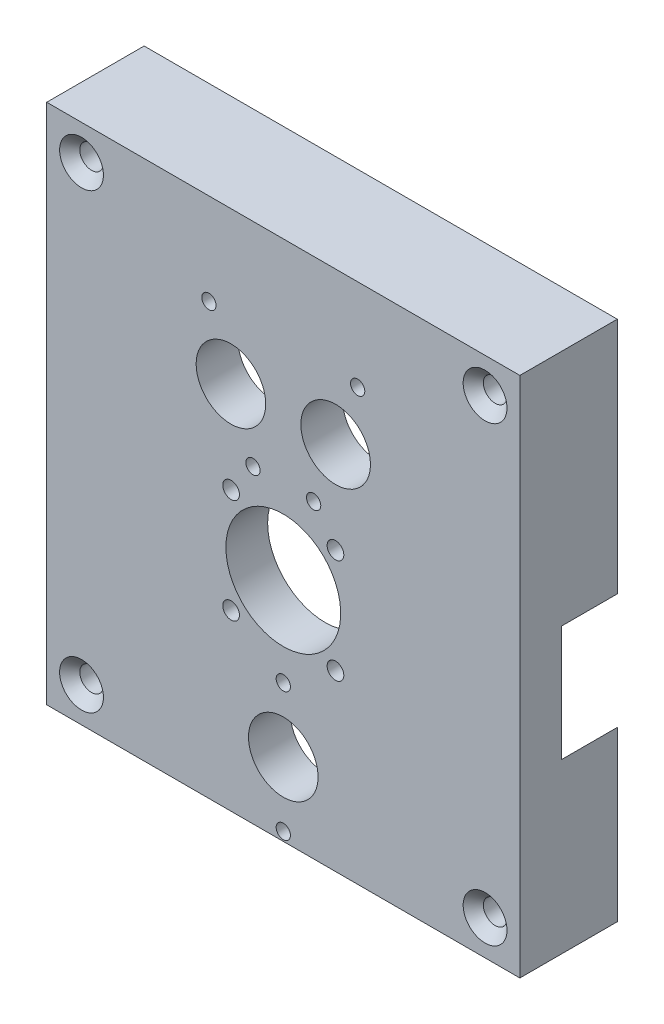
ISO-10303-21;
HEADER;
FILE_DESCRIPTION(('STEP AP214'),'2;1');
FILE_NAME('part.step','',(''),(''),'','','');
FILE_SCHEMA(('AUTOMOTIVE_DESIGN { 1 0 10303 214 1 1 1 1 }'));
ENDSEC;
DATA;
#1=APPLICATION_CONTEXT('core data for automotive mechanical design processes');
#2=APPLICATION_PROTOCOL_DEFINITION('international standard','automotive_design',2000,#1);
#3=PRODUCT_CONTEXT('',#1,'mechanical');
#4=PRODUCT('Part','Part','',(#3));
#5=PRODUCT_RELATED_PRODUCT_CATEGORY('part','',(#4));
#6=PRODUCT_DEFINITION_FORMATION('','',#4);
#7=PRODUCT_DEFINITION_CONTEXT('part definition',#1,'design');
#8=PRODUCT_DEFINITION('design','',#6,#7);
#9=PRODUCT_DEFINITION_SHAPE('','',#8);
#10=(LENGTH_UNIT() NAMED_UNIT(*) SI_UNIT(.MILLI.,.METRE.));
#11=(NAMED_UNIT(*) PLANE_ANGLE_UNIT() SI_UNIT($,.RADIAN.));
#12=(NAMED_UNIT(*) SI_UNIT($,.STERADIAN.) SOLID_ANGLE_UNIT());
#13=UNCERTAINTY_MEASURE_WITH_UNIT(LENGTH_MEASURE(1.E-05),#10,'distance_accuracy_value','');
#14=(GEOMETRIC_REPRESENTATION_CONTEXT(3) GLOBAL_UNCERTAINTY_ASSIGNED_CONTEXT((#13)) GLOBAL_UNIT_ASSIGNED_CONTEXT((#10,
#11,#12)) REPRESENTATION_CONTEXT('',''));
#15=CARTESIAN_POINT('',(0.,0.,0.));
#16=DIRECTION('',(0.,0.,1.));
#17=DIRECTION('',(1.,0.,0.));
#18=AXIS2_PLACEMENT_3D('',#15,#16,#17);
#19=CARTESIAN_POINT('',(0.,0.,0.));
#20=DIRECTION('',(0.,0.,-1.));
#21=DIRECTION('',(-1.,0.,0.));
#22=AXIS2_PLACEMENT_3D('',#19,#20,#21);
#23=PLANE('',#22);
#24=CARTESIAN_POINT('',(-29.,32.5,0.));
#25=DIRECTION('',(0.,0.,1.));
#26=DIRECTION('',(1.,0.,0.));
#27=AXIS2_PLACEMENT_3D('',#24,#25,#26);
#28=CIRCLE('',#27,1.7);
#29=CARTESIAN_POINT('',(-27.3,32.5,0.));
#30=VERTEX_POINT('',#29);
#31=EDGE_CURVE('E458',#30,#30,#28,.T.);
#32=ORIENTED_EDGE('',*,*,#31,.T.);
#33=EDGE_LOOP('',(#32));
#34=FACE_BOUND('',#33,.T.);
#35=CARTESIAN_POINT('',(29.,32.5,0.));
#36=DIRECTION('',(0.,0.,1.));
#37=DIRECTION('',(1.,0.,0.));
#38=AXIS2_PLACEMENT_3D('',#35,#36,#37);
#39=CIRCLE('',#38,1.7);
#40=CARTESIAN_POINT('',(30.7,32.5,0.));
#41=VERTEX_POINT('',#40);
#42=EDGE_CURVE('E484',#41,#41,#39,.T.);
#43=ORIENTED_EDGE('',*,*,#42,.T.);
#44=EDGE_LOOP('',(#43));
#45=FACE_BOUND('',#44,.T.);
#46=CARTESIAN_POINT('',(0.,-5.00000000000001,0.));
#47=DIRECTION('',(0.,0.,-1.));
#48=DIRECTION('',(-1.,0.,0.));
#49=AXIS2_PLACEMENT_3D('',#46,#47,#48);
#50=CIRCLE('',#49,35.);
#51=CARTESIAN_POINT('',(-34.,3.30662386291812,0.));
#52=VERTEX_POINT('',#51);
#53=CARTESIAN_POINT('',(34.,3.30662386291807,0.));
#54=VERTEX_POINT('',#53);
#55=EDGE_CURVE('E129',#52,#54,#50,.T.);
#56=ORIENTED_EDGE('',*,*,#55,.F.);
#57=DIRECTION('',(0.,-1.,0.));
#58=VECTOR('',#57,1.);
#59=CARTESIAN_POINT('',(-34.,-37.5,0.));
#60=LINE('',#59,#58);
#61=CARTESIAN_POINT('',(-34.,37.5,0.));
#62=VERTEX_POINT('',#61);
#63=EDGE_CURVE('E143',#62,#52,#60,.T.);
#64=ORIENTED_EDGE('',*,*,#63,.F.);
#65=DIRECTION('',(-1.,0.,0.));
#66=VECTOR('',#65,1.);
#67=CARTESIAN_POINT('',(-34.,37.5,0.));
#68=LINE('',#67,#66);
#69=CARTESIAN_POINT('',(34.,37.5,0.));
#70=VERTEX_POINT('',#69);
#71=EDGE_CURVE('E156',#70,#62,#68,.T.);
#72=ORIENTED_EDGE('',*,*,#71,.F.);
#73=DIRECTION('',(0.,1.,0.));
#74=VECTOR('',#73,1.);
#75=CARTESIAN_POINT('',(34.,-37.5,0.));
#76=LINE('',#75,#74);
#77=EDGE_CURVE('E144',#54,#70,#76,.T.);
#78=ORIENTED_EDGE('',*,*,#77,.F.);
#79=EDGE_LOOP('',(#56,#64,#72,#78));
#80=FACE_BOUND('',#79,.T.);
#81=ADVANCED_FACE('F37',(#34,#45,#80),#23,.T.);
#82=CARTESIAN_POINT('',(29.,-32.5,0.));
#83=DIRECTION('',(0.,0.,1.));
#84=DIRECTION('',(1.,0.,0.));
#85=AXIS2_PLACEMENT_3D('',#82,#83,#84);
#86=CIRCLE('',#85,1.7);
#87=CARTESIAN_POINT('',(30.7,-32.5,0.));
#88=VERTEX_POINT('',#87);
#89=EDGE_CURVE('E475',#88,#88,#86,.T.);
#90=ORIENTED_EDGE('',*,*,#89,.T.);
#91=EDGE_LOOP('',(#90));
#92=FACE_BOUND('',#91,.T.);
#93=CARTESIAN_POINT('',(34.,-13.3066238629181,0.));
#94=VERTEX_POINT('',#93);
#95=CARTESIAN_POINT('',(12.9903810567666,-37.5,0.));
#96=VERTEX_POINT('',#95);
#97=EDGE_CURVE('E146',#94,#96,#50,.T.);
#98=ORIENTED_EDGE('',*,*,#97,.F.);
#99=CARTESIAN_POINT('',(34.,-37.5,0.));
#100=VERTEX_POINT('',#99);
#101=EDGE_CURVE('E226',#100,#94,#76,.T.);
#102=ORIENTED_EDGE('',*,*,#101,.F.);
#103=DIRECTION('',(1.,0.,0.));
#104=VECTOR('',#103,1.);
#105=CARTESIAN_POINT('',(-34.,-37.5,0.));
#106=LINE('',#105,#104);
#107=EDGE_CURVE('E84',#96,#100,#106,.T.);
#108=ORIENTED_EDGE('',*,*,#107,.F.);
#109=EDGE_LOOP('',(#98,#102,#108));
#110=FACE_BOUND('',#109,.T.);
#111=ADVANCED_FACE('F243',(#92,#110),#23,.T.);
#112=CARTESIAN_POINT('',(0.,-5.00000000000001,14.));
#113=DIRECTION('',(0.,0.,-1.));
#114=DIRECTION('',(-1.,0.,0.));
#115=AXIS2_PLACEMENT_3D('',#112,#113,#114);
#116=CYLINDRICAL_SURFACE('',#115,8.25);
#117=CARTESIAN_POINT('',(0.,-5.00000000000001,14.));
#118=DIRECTION('',(0.,0.,-1.));
#119=DIRECTION('',(-1.,0.,0.));
#120=AXIS2_PLACEMENT_3D('',#117,#118,#119);
#121=CIRCLE('',#120,8.25);
#122=CARTESIAN_POINT('',(-8.25,-5.00000000000001,14.));
#123=VERTEX_POINT('',#122);
#124=EDGE_CURVE('E219',#123,#123,#121,.T.);
#125=ORIENTED_EDGE('',*,*,#124,.F.);
#126=EDGE_LOOP('',(#125));
#127=FACE_BOUND('',#126,.T.);
#128=CARTESIAN_POINT('',(0.,-5.00000000000001,8.));
#129=DIRECTION('',(0.,0.,-1.));
#130=DIRECTION('',(-1.,0.,0.));
#131=AXIS2_PLACEMENT_3D('',#128,#129,#130);
#132=CIRCLE('',#131,8.25);
#133=CARTESIAN_POINT('',(-8.25,-5.00000000000001,8.));
#134=VERTEX_POINT('',#133);
#135=EDGE_CURVE('E168',#134,#134,#132,.F.);
#136=ORIENTED_EDGE('',*,*,#135,.F.);
#137=EDGE_LOOP('',(#136));
#138=FACE_BOUND('',#137,.T.);
#139=ADVANCED_FACE('F241',(#127,#138),#116,.F.);
#140=CARTESIAN_POINT('',(34.,-37.5,14.));
#141=DIRECTION('',(-1.,0.,0.));
#142=DIRECTION('',(0.,0.,1.));
#143=AXIS2_PLACEMENT_3D('',#140,#141,#142);
#144=PLANE('',#143);
#145=DIRECTION('',(0.,-1.,0.));
#146=VECTOR('',#145,1.);
#147=CARTESIAN_POINT('',(34.,-37.5,8.));
#148=LINE('',#147,#146);
#149=CARTESIAN_POINT('',(34.,3.30662386291807,8.));
#150=VERTEX_POINT('',#149);
#151=CARTESIAN_POINT('',(34.,-13.3066238629181,8.));
#152=VERTEX_POINT('',#151);
#153=EDGE_CURVE('E208',#150,#152,#148,.T.);
#154=ORIENTED_EDGE('',*,*,#153,.F.);
#155=DIRECTION('',(0.,0.,-1.));
#156=VECTOR('',#155,1.);
#157=CARTESIAN_POINT('',(34.,3.30662386291807,8.));
#158=LINE('',#157,#156);
#159=EDGE_CURVE('E217',#150,#54,#158,.T.);
#160=ORIENTED_EDGE('',*,*,#159,.T.);
#161=ORIENTED_EDGE('',*,*,#77,.T.);
#162=DIRECTION('',(0.,0.,-1.));
#163=VECTOR('',#162,1.);
#164=CARTESIAN_POINT('',(34.,37.5,14.));
#165=LINE('',#164,#163);
#166=CARTESIAN_POINT('',(34.,37.5,14.));
#167=VERTEX_POINT('',#166);
#168=EDGE_CURVE('E11',#167,#70,#165,.T.);
#169=ORIENTED_EDGE('',*,*,#168,.F.);
#170=DIRECTION('',(0.,1.,0.));
#171=VECTOR('',#170,1.);
#172=CARTESIAN_POINT('',(34.,-37.5,14.));
#173=LINE('',#172,#171);
#174=CARTESIAN_POINT('',(34.,-37.5,14.));
#175=VERTEX_POINT('',#174);
#176=EDGE_CURVE('E161',#175,#167,#173,.T.);
#177=ORIENTED_EDGE('',*,*,#176,.F.);
#178=DIRECTION('',(0.,0.,-1.));
#179=VECTOR('',#178,1.);
#180=CARTESIAN_POINT('',(34.,-37.5,14.));
#181=LINE('',#180,#179);
#182=EDGE_CURVE('E162',#175,#100,#181,.T.);
#183=ORIENTED_EDGE('',*,*,#182,.T.);
#184=ORIENTED_EDGE('',*,*,#101,.T.);
#185=DIRECTION('',(0.,0.,-1.));
#186=VECTOR('',#185,1.);
#187=CARTESIAN_POINT('',(34.,-13.3066238629181,8.));
#188=LINE('',#187,#186);
#189=EDGE_CURVE('E214',#94,#152,#188,.F.);
#190=ORIENTED_EDGE('',*,*,#189,.T.);
#191=EDGE_LOOP('',(#154,#160,#161,#169,#177,#183,#184,#190));
#192=FACE_BOUND('',#191,.T.);
#193=ADVANCED_FACE('F39',(#192),#144,.F.);
#194=CARTESIAN_POINT('',(-34.,37.5,14.));
#195=DIRECTION('',(0.,-1.,0.));
#196=DIRECTION('',(0.,0.,-1.));
#197=AXIS2_PLACEMENT_3D('',#194,#195,#196);
#198=PLANE('',#197);
#199=ORIENTED_EDGE('',*,*,#71,.T.);
#200=DIRECTION('',(0.,0.,-1.));
#201=VECTOR('',#200,1.);
#202=CARTESIAN_POINT('',(-34.,37.5,14.));
#203=LINE('',#202,#201);
#204=CARTESIAN_POINT('',(-34.,37.5,14.));
#205=VERTEX_POINT('',#204);
#206=EDGE_CURVE('E46',#205,#62,#203,.T.);
#207=ORIENTED_EDGE('',*,*,#206,.F.);
#208=DIRECTION('',(-1.,0.,0.));
#209=VECTOR('',#208,1.);
#210=CARTESIAN_POINT('',(-34.,37.5,14.));
#211=LINE('',#210,#209);
#212=EDGE_CURVE('E91',#167,#205,#211,.T.);
#213=ORIENTED_EDGE('',*,*,#212,.F.);
#214=ORIENTED_EDGE('',*,*,#168,.T.);
#215=EDGE_LOOP('',(#199,#207,#213,#214));
#216=FACE_BOUND('',#215,.T.);
#217=ADVANCED_FACE('F233',(#216),#198,.F.);
#218=CARTESIAN_POINT('',(-34.,-37.5,14.));
#219=DIRECTION('',(1.,0.,0.));
#220=DIRECTION('',(0.,0.,-1.));
#221=AXIS2_PLACEMENT_3D('',#218,#219,#220);
#222=PLANE('',#221);
#223=DIRECTION('',(0.,1.,0.));
#224=VECTOR('',#223,1.);
#225=CARTESIAN_POINT('',(-34.,-37.5,8.));
#226=LINE('',#225,#224);
#227=CARTESIAN_POINT('',(-34.,-13.3066238629181,8.));
#228=VERTEX_POINT('',#227);
#229=CARTESIAN_POINT('',(-34.,3.30662386291812,8.));
#230=VERTEX_POINT('',#229);
#231=EDGE_CURVE('E206',#228,#230,#226,.T.);
#232=ORIENTED_EDGE('',*,*,#231,.F.);
#233=DIRECTION('',(0.,0.,-1.));
#234=VECTOR('',#233,1.);
#235=CARTESIAN_POINT('',(-34.,-13.3066238629181,8.));
#236=LINE('',#235,#234);
#237=CARTESIAN_POINT('',(-34.,-13.3066238629181,0.));
#238=VERTEX_POINT('',#237);
#239=EDGE_CURVE('E136',#228,#238,#236,.T.);
#240=ORIENTED_EDGE('',*,*,#239,.T.);
#241=CARTESIAN_POINT('',(-34.,-37.5,0.));
#242=VERTEX_POINT('',#241);
#243=EDGE_CURVE('E152',#238,#242,#60,.T.);
#244=ORIENTED_EDGE('',*,*,#243,.T.);
#245=DIRECTION('',(0.,0.,-1.));
#246=VECTOR('',#245,1.);
#247=CARTESIAN_POINT('',(-34.,-37.5,14.));
#248=LINE('',#247,#246);
#249=CARTESIAN_POINT('',(-34.,-37.5,14.));
#250=VERTEX_POINT('',#249);
#251=EDGE_CURVE('E164',#250,#242,#248,.T.);
#252=ORIENTED_EDGE('',*,*,#251,.F.);
#253=DIRECTION('',(0.,-1.,0.));
#254=VECTOR('',#253,1.);
#255=CARTESIAN_POINT('',(-34.,-37.5,14.));
#256=LINE('',#255,#254);
#257=EDGE_CURVE('E224',#205,#250,#256,.T.);
#258=ORIENTED_EDGE('',*,*,#257,.F.);
#259=ORIENTED_EDGE('',*,*,#206,.T.);
#260=ORIENTED_EDGE('',*,*,#63,.T.);
#261=DIRECTION('',(0.,0.,-1.));
#262=VECTOR('',#261,1.);
#263=CARTESIAN_POINT('',(-34.,3.30662386291812,8.));
#264=LINE('',#263,#262);
#265=EDGE_CURVE('E126',#52,#230,#264,.F.);
#266=ORIENTED_EDGE('',*,*,#265,.T.);
#267=EDGE_LOOP('',(#232,#240,#244,#252,#258,#259,#260,#266));
#268=FACE_BOUND('',#267,.T.);
#269=ADVANCED_FACE('F150',(#268),#222,.F.);
#270=CARTESIAN_POINT('',(-34.,-37.5,14.));
#271=DIRECTION('',(0.,1.,0.));
#272=DIRECTION('',(0.,0.,1.));
#273=AXIS2_PLACEMENT_3D('',#270,#271,#272);
#274=PLANE('',#273);
#275=DIRECTION('',(-1.,0.,0.));
#276=VECTOR('',#275,1.);
#277=CARTESIAN_POINT('',(-34.,-37.5,8.));
#278=LINE('',#277,#276);
#279=CARTESIAN_POINT('',(12.9903810567666,-37.5,8.));
#280=VERTEX_POINT('',#279);
#281=CARTESIAN_POINT('',(-12.9903810567666,-37.5,8.));
#282=VERTEX_POINT('',#281);
#283=EDGE_CURVE('E171',#280,#282,#278,.T.);
#284=ORIENTED_EDGE('',*,*,#283,.F.);
#285=DIRECTION('',(0.,0.,-1.));
#286=VECTOR('',#285,1.);
#287=CARTESIAN_POINT('',(12.9903810567666,-37.5,8.));
#288=LINE('',#287,#286);
#289=EDGE_CURVE('E137',#280,#96,#288,.T.);
#290=ORIENTED_EDGE('',*,*,#289,.T.);
#291=ORIENTED_EDGE('',*,*,#107,.T.);
#292=ORIENTED_EDGE('',*,*,#182,.F.);
#293=DIRECTION('',(1.,0.,0.));
#294=VECTOR('',#293,1.);
#295=CARTESIAN_POINT('',(-34.,-37.5,14.));
#296=LINE('',#295,#294);
#297=EDGE_CURVE('E63',#250,#175,#296,.T.);
#298=ORIENTED_EDGE('',*,*,#297,.F.);
#299=ORIENTED_EDGE('',*,*,#251,.T.);
#300=CARTESIAN_POINT('',(-12.9903810567666,-37.5,0.));
#301=VERTEX_POINT('',#300);
#302=EDGE_CURVE('E154',#242,#301,#106,.T.);
#303=ORIENTED_EDGE('',*,*,#302,.T.);
#304=DIRECTION('',(0.,0.,-1.));
#305=VECTOR('',#304,1.);
#306=CARTESIAN_POINT('',(-12.9903810567666,-37.5,8.));
#307=LINE('',#306,#305);
#308=EDGE_CURVE('E54',#301,#282,#307,.F.);
#309=ORIENTED_EDGE('',*,*,#308,.T.);
#310=EDGE_LOOP('',(#284,#290,#291,#292,#298,#299,#303,#309));
#311=FACE_BOUND('',#310,.T.);
#312=ADVANCED_FACE('F239',(#311),#274,.F.);
#313=CARTESIAN_POINT('',(0.,0.,14.));
#314=DIRECTION('',(0.,0.,-1.));
#315=DIRECTION('',(-1.,0.,0.));
#316=AXIS2_PLACEMENT_3D('',#313,#314,#315);
#317=PLANE('',#316);
#318=CARTESIAN_POINT('',(-29.,32.5,14.));
#319=DIRECTION('',(0.,0.,1.));
#320=DIRECTION('',(1.,0.,0.));
#321=AXIS2_PLACEMENT_3D('',#318,#319,#320);
#322=CIRCLE('',#321,3.15);
#323=CARTESIAN_POINT('',(-25.85,32.5,14.));
#324=VERTEX_POINT('',#323);
#325=EDGE_CURVE('E456',#324,#324,#322,.T.);
#326=ORIENTED_EDGE('',*,*,#325,.F.);
#327=EDGE_LOOP('',(#326));
#328=FACE_BOUND('',#327,.T.);
#329=CARTESIAN_POINT('',(-29.,-32.5,14.));
#330=DIRECTION('',(0.,0.,1.));
#331=DIRECTION('',(1.,0.,0.));
#332=AXIS2_PLACEMENT_3D('',#329,#330,#331);
#333=CIRCLE('',#332,3.15);
#334=CARTESIAN_POINT('',(-25.85,-32.5,14.));
#335=VERTEX_POINT('',#334);
#336=EDGE_CURVE('E462',#335,#335,#333,.T.);
#337=ORIENTED_EDGE('',*,*,#336,.F.);
#338=EDGE_LOOP('',(#337));
#339=FACE_BOUND('',#338,.T.);
#340=CARTESIAN_POINT('',(29.,-32.5,14.));
#341=DIRECTION('',(0.,0.,1.));
#342=DIRECTION('',(1.,0.,0.));
#343=AXIS2_PLACEMENT_3D('',#340,#341,#342);
#344=CIRCLE('',#343,3.15);
#345=CARTESIAN_POINT('',(32.15,-32.5,14.));
#346=VERTEX_POINT('',#345);
#347=EDGE_CURVE('E469',#346,#346,#344,.T.);
#348=ORIENTED_EDGE('',*,*,#347,.F.);
#349=EDGE_LOOP('',(#348));
#350=FACE_BOUND('',#349,.T.);
#351=CARTESIAN_POINT('',(29.,32.5,14.));
#352=DIRECTION('',(0.,0.,1.));
#353=DIRECTION('',(1.,0.,0.));
#354=AXIS2_PLACEMENT_3D('',#351,#352,#353);
#355=CIRCLE('',#354,3.15);
#356=CARTESIAN_POINT('',(32.15,32.5,14.));
#357=VERTEX_POINT('',#356);
#358=EDGE_CURVE('E478',#357,#357,#355,.T.);
#359=ORIENTED_EDGE('',*,*,#358,.F.);
#360=EDGE_LOOP('',(#359));
#361=FACE_BOUND('',#360,.T.);
#362=CARTESIAN_POINT('',(-7.52444315316458,15.67323765729,14.));
#363=DIRECTION('',(0.,0.,-1.));
#364=DIRECTION('',(-1.,0.,0.));
#365=AXIS2_PLACEMENT_3D('',#362,#363,#364);
#366=CIRCLE('',#365,5.);
#367=CARTESIAN_POINT('',(-12.5244431531646,15.67323765729,14.));
#368=VERTEX_POINT('',#367);
#369=EDGE_CURVE('E487',#368,#368,#366,.T.);
#370=ORIENTED_EDGE('',*,*,#369,.T.);
#371=EDGE_LOOP('',(#370));
#372=FACE_BOUND('',#371,.T.);
#373=CARTESIAN_POINT('',(0.,-27.,14.));
#374=DIRECTION('',(0.,0.,-1.));
#375=DIRECTION('',(-1.,0.,0.));
#376=AXIS2_PLACEMENT_3D('',#373,#374,#375);
#377=CIRCLE('',#376,5.);
#378=CARTESIAN_POINT('',(-5.,-27.,14.));
#379=VERTEX_POINT('',#378);
#380=EDGE_CURVE('E491',#379,#379,#377,.T.);
#381=ORIENTED_EDGE('',*,*,#380,.T.);
#382=EDGE_LOOP('',(#381));
#383=FACE_BOUND('',#382,.T.);
#384=CARTESIAN_POINT('',(7.52444315316458,15.67323765729,14.));
#385=DIRECTION('',(0.,0.,-1.));
#386=DIRECTION('',(-1.,0.,0.));
#387=AXIS2_PLACEMENT_3D('',#384,#385,#386);
#388=CIRCLE('',#387,5.);
#389=CARTESIAN_POINT('',(2.52444315316458,15.67323765729,14.));
#390=VERTEX_POINT('',#389);
#391=EDGE_CURVE('E495',#390,#390,#388,.T.);
#392=ORIENTED_EDGE('',*,*,#391,.T.);
#393=EDGE_LOOP('',(#392));
#394=FACE_BOUND('',#393,.T.);
#395=CARTESIAN_POINT('',(0.,-17.75,14.));
#396=DIRECTION('',(0.,0.,-1.));
#397=DIRECTION('',(-1.,0.,0.));
#398=AXIS2_PLACEMENT_3D('',#395,#396,#397);
#399=CIRCLE('',#398,1.02499999999999);
#400=CARTESIAN_POINT('',(-1.02499999999999,-17.75,14.));
#401=VERTEX_POINT('',#400);
#402=EDGE_CURVE('E500',#401,#401,#399,.T.);
#403=ORIENTED_EDGE('',*,*,#402,.T.);
#404=EDGE_LOOP('',(#403));
#405=FACE_BOUND('',#404,.T.);
#406=CARTESIAN_POINT('',(0.,-36.25,14.));
#407=DIRECTION('',(0.,0.,-1.));
#408=DIRECTION('',(-1.,0.,0.));
#409=AXIS2_PLACEMENT_3D('',#406,#407,#408);
#410=CIRCLE('',#409,1.02499999999999);
#411=CARTESIAN_POINT('',(-1.02499999999999,-36.25,14.));
#412=VERTEX_POINT('',#411);
#413=EDGE_CURVE('E504',#412,#412,#410,.T.);
#414=ORIENTED_EDGE('',*,*,#413,.T.);
#415=EDGE_LOOP('',(#414));
#416=FACE_BOUND('',#415,.T.);
#417=CARTESIAN_POINT('',(10.688129478927,24.3653943995597,14.));
#418=DIRECTION('',(0.,0.,-1.));
#419=DIRECTION('',(-1.,0.,0.));
#420=AXIS2_PLACEMENT_3D('',#417,#418,#419);
#421=CIRCLE('',#420,1.025);
#422=CARTESIAN_POINT('',(9.66312947892696,24.3653943995597,14.));
#423=VERTEX_POINT('',#422);
#424=EDGE_CURVE('E508',#423,#423,#421,.T.);
#425=ORIENTED_EDGE('',*,*,#424,.T.);
#426=EDGE_LOOP('',(#425));
#427=FACE_BOUND('',#426,.T.);
#428=CARTESIAN_POINT('',(4.3607568274022,6.98108091502035,14.));
#429=DIRECTION('',(0.,0.,-1.));
#430=DIRECTION('',(-1.,0.,0.));
#431=AXIS2_PLACEMENT_3D('',#428,#429,#430);
#432=CIRCLE('',#431,1.025);
#433=CARTESIAN_POINT('',(3.3357568274022,6.98108091502035,14.));
#434=VERTEX_POINT('',#433);
#435=EDGE_CURVE('E512',#434,#434,#432,.T.);
#436=ORIENTED_EDGE('',*,*,#435,.T.);
#437=EDGE_LOOP('',(#436));
#438=FACE_BOUND('',#437,.T.);
#439=CARTESIAN_POINT('',(-10.688129478927,24.3653943995597,14.));
#440=DIRECTION('',(0.,0.,-1.));
#441=DIRECTION('',(-1.,0.,0.));
#442=AXIS2_PLACEMENT_3D('',#439,#440,#441);
#443=CIRCLE('',#442,1.025);
#444=CARTESIAN_POINT('',(-11.713129478927,24.3653943995597,14.));
#445=VERTEX_POINT('',#444);
#446=EDGE_CURVE('E516',#445,#445,#443,.T.);
#447=ORIENTED_EDGE('',*,*,#446,.T.);
#448=EDGE_LOOP('',(#447));
#449=FACE_BOUND('',#448,.T.);
#450=CARTESIAN_POINT('',(-4.3607568274022,6.98108091502035,14.));
#451=DIRECTION('',(0.,0.,-1.));
#452=DIRECTION('',(-1.,0.,0.));
#453=AXIS2_PLACEMENT_3D('',#450,#451,#452);
#454=CIRCLE('',#453,1.025);
#455=CARTESIAN_POINT('',(-5.3857568274022,6.98108091502035,14.));
#456=VERTEX_POINT('',#455);
#457=EDGE_CURVE('E520',#456,#456,#454,.T.);
#458=ORIENTED_EDGE('',*,*,#457,.T.);
#459=EDGE_LOOP('',(#458));
#460=FACE_BOUND('',#459,.T.);
#461=CARTESIAN_POINT('',(7.5,2.49999999999999,14.));
#462=DIRECTION('',(0.,0.,-1.));
#463=DIRECTION('',(-1.,0.,0.));
#464=AXIS2_PLACEMENT_3D('',#461,#462,#463);
#465=CIRCLE('',#464,1.19999999999999);
#466=CARTESIAN_POINT('',(6.30000000000001,2.49999999999999,14.));
#467=VERTEX_POINT('',#466);
#468=EDGE_CURVE('E41',#467,#467,#465,.T.);
#469=ORIENTED_EDGE('',*,*,#468,.T.);
#470=EDGE_LOOP('',(#469));
#471=FACE_BOUND('',#470,.T.);
#472=CARTESIAN_POINT('',(-7.5,-12.5,14.));
#473=DIRECTION('',(0.,0.,-1.));
#474=DIRECTION('',(-1.,0.,0.));
#475=AXIS2_PLACEMENT_3D('',#472,#473,#474);
#476=CIRCLE('',#475,1.19999999999999);
#477=CARTESIAN_POINT('',(-8.69999999999999,-12.5,14.));
#478=VERTEX_POINT('',#477);
#479=EDGE_CURVE('E180',#478,#478,#476,.T.);
#480=ORIENTED_EDGE('',*,*,#479,.T.);
#481=EDGE_LOOP('',(#480));
#482=FACE_BOUND('',#481,.T.);
#483=CARTESIAN_POINT('',(7.5,-12.5,14.));
#484=DIRECTION('',(0.,0.,-1.));
#485=DIRECTION('',(-1.,0.,0.));
#486=AXIS2_PLACEMENT_3D('',#483,#484,#485);
#487=CIRCLE('',#486,1.19999999999999);
#488=CARTESIAN_POINT('',(6.30000000000001,-12.5,14.));
#489=VERTEX_POINT('',#488);
#490=EDGE_CURVE('E176',#489,#489,#487,.T.);
#491=ORIENTED_EDGE('',*,*,#490,.T.);
#492=EDGE_LOOP('',(#491));
#493=FACE_BOUND('',#492,.T.);
#494=CARTESIAN_POINT('',(-7.5,2.49999999999999,14.));
#495=DIRECTION('',(0.,0.,-1.));
#496=DIRECTION('',(-1.,0.,0.));
#497=AXIS2_PLACEMENT_3D('',#494,#495,#496);
#498=CIRCLE('',#497,1.19999999999999);
#499=CARTESIAN_POINT('',(-8.69999999999999,2.49999999999999,14.));
#500=VERTEX_POINT('',#499);
#501=EDGE_CURVE('E172',#500,#500,#498,.T.);
#502=ORIENTED_EDGE('',*,*,#501,.T.);
#503=EDGE_LOOP('',(#502));
#504=FACE_BOUND('',#503,.T.);
#505=ORIENTED_EDGE('',*,*,#124,.T.);
#506=EDGE_LOOP('',(#505));
#507=FACE_BOUND('',#506,.T.);
#508=ORIENTED_EDGE('',*,*,#176,.T.);
#509=ORIENTED_EDGE('',*,*,#212,.T.);
#510=ORIENTED_EDGE('',*,*,#257,.T.);
#511=ORIENTED_EDGE('',*,*,#297,.T.);
#512=EDGE_LOOP('',(#508,#509,#510,#511));
#513=FACE_BOUND('',#512,.T.);
#514=ADVANCED_FACE('F256',(#328,#339,#350,#361,#372,#383,#394,#405,#416,#427,#438,#449,#460,
#471,#482,#493,#504,#507,#513),#317,.F.);
#515=CARTESIAN_POINT('',(-29.,-32.5,0.));
#516=DIRECTION('',(0.,0.,1.));
#517=DIRECTION('',(1.,0.,0.));
#518=AXIS2_PLACEMENT_3D('',#515,#516,#517);
#519=CIRCLE('',#518,1.7);
#520=CARTESIAN_POINT('',(-27.3,-32.5,0.));
#521=VERTEX_POINT('',#520);
#522=EDGE_CURVE('E269',#521,#521,#519,.T.);
#523=ORIENTED_EDGE('',*,*,#522,.T.);
#524=EDGE_LOOP('',(#523));
#525=FACE_BOUND('',#524,.T.);
#526=EDGE_CURVE('E148',#301,#238,#50,.T.);
#527=ORIENTED_EDGE('',*,*,#526,.F.);
#528=ORIENTED_EDGE('',*,*,#302,.F.);
#529=ORIENTED_EDGE('',*,*,#243,.F.);
#530=EDGE_LOOP('',(#527,#528,#529));
#531=FACE_BOUND('',#530,.T.);
#532=ADVANCED_FACE('F246',(#525,#531),#23,.T.);
#533=CARTESIAN_POINT('',(0.,-5.00000000000001,8.));
#534=DIRECTION('',(0.,0.,-1.));
#535=DIRECTION('',(-1.,0.,0.));
#536=AXIS2_PLACEMENT_3D('',#533,#534,#535);
#537=CYLINDRICAL_SURFACE('',#536,35.);
#538=CARTESIAN_POINT('',(0.,-5.00000000000001,8.));
#539=DIRECTION('',(0.,0.,-1.));
#540=DIRECTION('',(-1.,0.,0.));
#541=AXIS2_PLACEMENT_3D('',#538,#539,#540);
#542=CIRCLE('',#541,35.);
#543=EDGE_CURVE('E132',#230,#150,#542,.T.);
#544=ORIENTED_EDGE('',*,*,#543,.F.);
#545=ORIENTED_EDGE('',*,*,#265,.F.);
#546=ORIENTED_EDGE('',*,*,#55,.T.);
#547=ORIENTED_EDGE('',*,*,#159,.F.);
#548=EDGE_LOOP('',(#544,#545,#546,#547));
#549=FACE_BOUND('',#548,.T.);
#550=ADVANCED_FACE('F128',(#549),#537,.F.);
#551=ORIENTED_EDGE('',*,*,#97,.T.);
#552=ORIENTED_EDGE('',*,*,#289,.F.);
#553=EDGE_CURVE('E203',#152,#280,#542,.T.);
#554=ORIENTED_EDGE('',*,*,#553,.F.);
#555=ORIENTED_EDGE('',*,*,#189,.F.);
#556=EDGE_LOOP('',(#551,#552,#554,#555));
#557=FACE_BOUND('',#556,.T.);
#558=ADVANCED_FACE('F262',(#557),#537,.F.);
#559=EDGE_CURVE('E145',#282,#228,#542,.T.);
#560=ORIENTED_EDGE('',*,*,#559,.F.);
#561=ORIENTED_EDGE('',*,*,#308,.F.);
#562=ORIENTED_EDGE('',*,*,#526,.T.);
#563=ORIENTED_EDGE('',*,*,#239,.F.);
#564=EDGE_LOOP('',(#560,#561,#562,#563));
#565=FACE_BOUND('',#564,.T.);
#566=ADVANCED_FACE('F264',(#565),#537,.F.);
#567=CARTESIAN_POINT('',(0.,-5.00000000000001,8.));
#568=DIRECTION('',(0.,0.,-1.));
#569=DIRECTION('',(-1.,0.,0.));
#570=AXIS2_PLACEMENT_3D('',#567,#568,#569);
#571=PLANE('',#570);
#572=CARTESIAN_POINT('',(-7.52444315316458,15.67323765729,8.));
#573=DIRECTION('',(0.,0.,-1.));
#574=DIRECTION('',(-1.,0.,0.));
#575=AXIS2_PLACEMENT_3D('',#572,#573,#574);
#576=CIRCLE('',#575,5.);
#577=CARTESIAN_POINT('',(-12.5244431531646,15.67323765729,8.));
#578=VERTEX_POINT('',#577);
#579=EDGE_CURVE('E308',#578,#578,#576,.T.);
#580=ORIENTED_EDGE('',*,*,#579,.F.);
#581=EDGE_LOOP('',(#580));
#582=FACE_BOUND('',#581,.T.);
#583=CARTESIAN_POINT('',(0.,-27.,8.));
#584=DIRECTION('',(0.,0.,-1.));
#585=DIRECTION('',(-1.,0.,0.));
#586=AXIS2_PLACEMENT_3D('',#583,#584,#585);
#587=CIRCLE('',#586,5.);
#588=CARTESIAN_POINT('',(-5.,-27.,8.));
#589=VERTEX_POINT('',#588);
#590=EDGE_CURVE('E312',#589,#589,#587,.T.);
#591=ORIENTED_EDGE('',*,*,#590,.F.);
#592=EDGE_LOOP('',(#591));
#593=FACE_BOUND('',#592,.T.);
#594=CARTESIAN_POINT('',(7.52444315316458,15.67323765729,8.));
#595=DIRECTION('',(0.,0.,-1.));
#596=DIRECTION('',(-1.,0.,0.));
#597=AXIS2_PLACEMENT_3D('',#594,#595,#596);
#598=CIRCLE('',#597,5.);
#599=CARTESIAN_POINT('',(2.52444315316458,15.67323765729,8.));
#600=VERTEX_POINT('',#599);
#601=EDGE_CURVE('E316',#600,#600,#598,.T.);
#602=ORIENTED_EDGE('',*,*,#601,.F.);
#603=EDGE_LOOP('',(#602));
#604=FACE_BOUND('',#603,.T.);
#605=CARTESIAN_POINT('',(0.,-17.75,8.));
#606=DIRECTION('',(0.,0.,-1.));
#607=DIRECTION('',(-1.,0.,0.));
#608=AXIS2_PLACEMENT_3D('',#605,#606,#607);
#609=CIRCLE('',#608,1.02499999999999);
#610=CARTESIAN_POINT('',(-1.02499999999999,-17.75,8.));
#611=VERTEX_POINT('',#610);
#612=EDGE_CURVE('E320',#611,#611,#609,.T.);
#613=ORIENTED_EDGE('',*,*,#612,.F.);
#614=EDGE_LOOP('',(#613));
#615=FACE_BOUND('',#614,.T.);
#616=CARTESIAN_POINT('',(0.,-36.25,8.));
#617=DIRECTION('',(0.,0.,-1.));
#618=DIRECTION('',(-1.,0.,0.));
#619=AXIS2_PLACEMENT_3D('',#616,#617,#618);
#620=CIRCLE('',#619,1.02499999999999);
#621=CARTESIAN_POINT('',(-1.02499999999999,-36.25,8.));
#622=VERTEX_POINT('',#621);
#623=EDGE_CURVE('E324',#622,#622,#620,.T.);
#624=ORIENTED_EDGE('',*,*,#623,.F.);
#625=EDGE_LOOP('',(#624));
#626=FACE_BOUND('',#625,.T.);
#627=CARTESIAN_POINT('',(10.688129478927,24.3653943995597,8.));
#628=DIRECTION('',(0.,0.,-1.));
#629=DIRECTION('',(-1.,0.,0.));
#630=AXIS2_PLACEMENT_3D('',#627,#628,#629);
#631=CIRCLE('',#630,1.025);
#632=CARTESIAN_POINT('',(9.66312947892696,24.3653943995597,8.));
#633=VERTEX_POINT('',#632);
#634=EDGE_CURVE('E328',#633,#633,#631,.T.);
#635=ORIENTED_EDGE('',*,*,#634,.F.);
#636=EDGE_LOOP('',(#635));
#637=FACE_BOUND('',#636,.T.);
#638=CARTESIAN_POINT('',(4.3607568274022,6.98108091502035,8.));
#639=DIRECTION('',(0.,0.,-1.));
#640=DIRECTION('',(-1.,0.,0.));
#641=AXIS2_PLACEMENT_3D('',#638,#639,#640);
#642=CIRCLE('',#641,1.025);
#643=CARTESIAN_POINT('',(3.3357568274022,6.98108091502035,8.));
#644=VERTEX_POINT('',#643);
#645=EDGE_CURVE('E332',#644,#644,#642,.T.);
#646=ORIENTED_EDGE('',*,*,#645,.F.);
#647=EDGE_LOOP('',(#646));
#648=FACE_BOUND('',#647,.T.);
#649=CARTESIAN_POINT('',(-10.688129478927,24.3653943995597,8.));
#650=DIRECTION('',(0.,0.,-1.));
#651=DIRECTION('',(-1.,0.,0.));
#652=AXIS2_PLACEMENT_3D('',#649,#650,#651);
#653=CIRCLE('',#652,1.025);
#654=CARTESIAN_POINT('',(-11.713129478927,24.3653943995597,8.));
#655=VERTEX_POINT('',#654);
#656=EDGE_CURVE('E336',#655,#655,#653,.T.);
#657=ORIENTED_EDGE('',*,*,#656,.F.);
#658=EDGE_LOOP('',(#657));
#659=FACE_BOUND('',#658,.T.);
#660=CARTESIAN_POINT('',(-4.3607568274022,6.98108091502035,8.));
#661=DIRECTION('',(0.,0.,-1.));
#662=DIRECTION('',(-1.,0.,0.));
#663=AXIS2_PLACEMENT_3D('',#660,#661,#662);
#664=CIRCLE('',#663,1.025);
#665=CARTESIAN_POINT('',(-5.3857568274022,6.98108091502035,8.));
#666=VERTEX_POINT('',#665);
#667=EDGE_CURVE('E340',#666,#666,#664,.T.);
#668=ORIENTED_EDGE('',*,*,#667,.F.);
#669=EDGE_LOOP('',(#668));
#670=FACE_BOUND('',#669,.T.);
#671=CARTESIAN_POINT('',(7.5,2.49999999999999,8.));
#672=DIRECTION('',(0.,0.,-1.));
#673=DIRECTION('',(-1.,0.,0.));
#674=AXIS2_PLACEMENT_3D('',#671,#672,#673);
#675=CIRCLE('',#674,2.2);
#676=CARTESIAN_POINT('',(5.3,2.49999999999999,8.));
#677=VERTEX_POINT('',#676);
#678=EDGE_CURVE('E344',#677,#677,#675,.T.);
#679=ORIENTED_EDGE('',*,*,#678,.F.);
#680=EDGE_LOOP('',(#679));
#681=FACE_BOUND('',#680,.T.);
#682=CARTESIAN_POINT('',(-7.5,-12.5,8.));
#683=DIRECTION('',(0.,0.,-1.));
#684=DIRECTION('',(-1.,0.,0.));
#685=AXIS2_PLACEMENT_3D('',#682,#683,#684);
#686=CIRCLE('',#685,2.2);
#687=CARTESIAN_POINT('',(-9.7,-12.5,8.));
#688=VERTEX_POINT('',#687);
#689=EDGE_CURVE('E189',#688,#688,#686,.T.);
#690=ORIENTED_EDGE('',*,*,#689,.F.);
#691=EDGE_LOOP('',(#690));
#692=FACE_BOUND('',#691,.T.);
#693=CARTESIAN_POINT('',(7.5,-12.5,8.));
#694=DIRECTION('',(0.,0.,-1.));
#695=DIRECTION('',(-1.,0.,0.));
#696=AXIS2_PLACEMENT_3D('',#693,#694,#695);
#697=CIRCLE('',#696,2.2);
#698=CARTESIAN_POINT('',(5.3,-12.5,8.));
#699=VERTEX_POINT('',#698);
#700=EDGE_CURVE('E182',#699,#699,#697,.T.);
#701=ORIENTED_EDGE('',*,*,#700,.F.);
#702=EDGE_LOOP('',(#701));
#703=FACE_BOUND('',#702,.T.);
#704=CARTESIAN_POINT('',(-7.5,2.49999999999999,8.));
#705=DIRECTION('',(0.,0.,-1.));
#706=DIRECTION('',(-1.,0.,0.));
#707=AXIS2_PLACEMENT_3D('',#704,#705,#706);
#708=CIRCLE('',#707,2.2);
#709=CARTESIAN_POINT('',(-9.7,2.49999999999999,8.));
#710=VERTEX_POINT('',#709);
#711=EDGE_CURVE('E178',#710,#710,#708,.T.);
#712=ORIENTED_EDGE('',*,*,#711,.F.);
#713=EDGE_LOOP('',(#712));
#714=FACE_BOUND('',#713,.T.);
#715=ORIENTED_EDGE('',*,*,#135,.T.);
#716=EDGE_LOOP('',(#715));
#717=FACE_BOUND('',#716,.T.);
#718=ORIENTED_EDGE('',*,*,#153,.T.);
#719=ORIENTED_EDGE('',*,*,#553,.T.);
#720=ORIENTED_EDGE('',*,*,#283,.T.);
#721=ORIENTED_EDGE('',*,*,#559,.T.);
#722=ORIENTED_EDGE('',*,*,#231,.T.);
#723=ORIENTED_EDGE('',*,*,#543,.T.);
#724=EDGE_LOOP('',(#718,#719,#720,#721,#722,#723));
#725=FACE_BOUND('',#724,.T.);
#726=ADVANCED_FACE('F276',(#582,#593,#604,#615,#626,#637,#648,#659,#670,#681,#692,#703,#714,
#717,#725),#571,.T.);
#727=CARTESIAN_POINT('',(-7.5,2.49999999999999,8.));
#728=DIRECTION('',(0.,0.,-1.));
#729=DIRECTION('',(-1.,0.,0.));
#730=AXIS2_PLACEMENT_3D('',#727,#728,#729);
#731=CYLINDRICAL_SURFACE('',#730,1.19999999999999);
#732=CARTESIAN_POINT('',(-7.5,2.49999999999999,9.));
#733=DIRECTION('',(0.,0.,-1.));
#734=DIRECTION('',(-1.,0.,0.));
#735=AXIS2_PLACEMENT_3D('',#732,#733,#734);
#736=CIRCLE('',#735,1.19999999999999);
#737=CARTESIAN_POINT('',(-8.69999999999999,2.49999999999999,9.));
#738=VERTEX_POINT('',#737);
#739=EDGE_CURVE('E175',#738,#738,#736,.T.);
#740=ORIENTED_EDGE('',*,*,#739,.T.);
#741=EDGE_LOOP('',(#740));
#742=FACE_BOUND('',#741,.T.);
#743=ORIENTED_EDGE('',*,*,#501,.F.);
#744=EDGE_LOOP('',(#743));
#745=FACE_BOUND('',#744,.T.);
#746=ADVANCED_FACE('F298',(#742,#745),#731,.F.);
#747=CARTESIAN_POINT('',(-7.5,2.49999999999999,8.));
#748=DIRECTION('',(0.,0.,-1.));
#749=DIRECTION('',(-1.,0.,0.));
#750=AXIS2_PLACEMENT_3D('',#747,#748,#749);
#751=CONICAL_SURFACE('',#750,2.2,0.785398163397453);
#752=ORIENTED_EDGE('',*,*,#739,.F.);
#753=EDGE_LOOP('',(#752));
#754=FACE_BOUND('',#753,.T.);
#755=ORIENTED_EDGE('',*,*,#711,.T.);
#756=EDGE_LOOP('',(#755));
#757=FACE_BOUND('',#756,.T.);
#758=ADVANCED_FACE('F303',(#754,#757),#751,.F.);
#759=CARTESIAN_POINT('',(7.5,-12.5,8.));
#760=DIRECTION('',(0.,0.,-1.));
#761=DIRECTION('',(-1.,0.,0.));
#762=AXIS2_PLACEMENT_3D('',#759,#760,#761);
#763=CYLINDRICAL_SURFACE('',#762,1.19999999999999);
#764=CARTESIAN_POINT('',(7.5,-12.5,9.));
#765=DIRECTION('',(0.,0.,-1.));
#766=DIRECTION('',(-1.,0.,0.));
#767=AXIS2_PLACEMENT_3D('',#764,#765,#766);
#768=CIRCLE('',#767,1.19999999999999);
#769=CARTESIAN_POINT('',(6.30000000000001,-12.5,9.));
#770=VERTEX_POINT('',#769);
#771=EDGE_CURVE('E179',#770,#770,#768,.T.);
#772=ORIENTED_EDGE('',*,*,#771,.T.);
#773=EDGE_LOOP('',(#772));
#774=FACE_BOUND('',#773,.T.);
#775=ORIENTED_EDGE('',*,*,#490,.F.);
#776=EDGE_LOOP('',(#775));
#777=FACE_BOUND('',#776,.T.);
#778=ADVANCED_FACE('F352',(#774,#777),#763,.F.);
#779=CARTESIAN_POINT('',(7.5,-12.5,8.));
#780=DIRECTION('',(0.,0.,-1.));
#781=DIRECTION('',(-1.,0.,0.));
#782=AXIS2_PLACEMENT_3D('',#779,#780,#781);
#783=CONICAL_SURFACE('',#782,2.2,0.785398163397453);
#784=ORIENTED_EDGE('',*,*,#771,.F.);
#785=EDGE_LOOP('',(#784));
#786=FACE_BOUND('',#785,.T.);
#787=ORIENTED_EDGE('',*,*,#700,.T.);
#788=EDGE_LOOP('',(#787));
#789=FACE_BOUND('',#788,.T.);
#790=ADVANCED_FACE('F358',(#786,#789),#783,.F.);
#791=CARTESIAN_POINT('',(-7.5,-12.5,8.));
#792=DIRECTION('',(0.,0.,-1.));
#793=DIRECTION('',(-1.,0.,0.));
#794=AXIS2_PLACEMENT_3D('',#791,#792,#793);
#795=CYLINDRICAL_SURFACE('',#794,1.19999999999999);
#796=CARTESIAN_POINT('',(-7.5,-12.5,9.));
#797=DIRECTION('',(0.,0.,-1.));
#798=DIRECTION('',(-1.,0.,0.));
#799=AXIS2_PLACEMENT_3D('',#796,#797,#798);
#800=CIRCLE('',#799,1.19999999999999);
#801=CARTESIAN_POINT('',(-8.69999999999999,-12.5,9.));
#802=VERTEX_POINT('',#801);
#803=EDGE_CURVE('E183',#802,#802,#800,.T.);
#804=ORIENTED_EDGE('',*,*,#803,.T.);
#805=EDGE_LOOP('',(#804));
#806=FACE_BOUND('',#805,.T.);
#807=ORIENTED_EDGE('',*,*,#479,.F.);
#808=EDGE_LOOP('',(#807));
#809=FACE_BOUND('',#808,.T.);
#810=ADVANCED_FACE('F365',(#806,#809),#795,.F.);
#811=CARTESIAN_POINT('',(-7.5,-12.5,8.));
#812=DIRECTION('',(0.,0.,-1.));
#813=DIRECTION('',(-1.,0.,0.));
#814=AXIS2_PLACEMENT_3D('',#811,#812,#813);
#815=CONICAL_SURFACE('',#814,2.2,0.785398163397453);
#816=ORIENTED_EDGE('',*,*,#803,.F.);
#817=EDGE_LOOP('',(#816));
#818=FACE_BOUND('',#817,.T.);
#819=ORIENTED_EDGE('',*,*,#689,.T.);
#820=EDGE_LOOP('',(#819));
#821=FACE_BOUND('',#820,.T.);
#822=ADVANCED_FACE('F369',(#818,#821),#815,.F.);
#823=CARTESIAN_POINT('',(7.5,2.49999999999999,8.));
#824=DIRECTION('',(0.,0.,-1.));
#825=DIRECTION('',(-1.,0.,0.));
#826=AXIS2_PLACEMENT_3D('',#823,#824,#825);
#827=CYLINDRICAL_SURFACE('',#826,1.19999999999999);
#828=CARTESIAN_POINT('',(7.5,2.49999999999999,9.));
#829=DIRECTION('',(0.,0.,-1.));
#830=DIRECTION('',(-1.,0.,0.));
#831=AXIS2_PLACEMENT_3D('',#828,#829,#830);
#832=CIRCLE('',#831,1.19999999999999);
#833=CARTESIAN_POINT('',(6.30000000000001,2.49999999999999,9.));
#834=VERTEX_POINT('',#833);
#835=EDGE_CURVE('E523',#834,#834,#832,.T.);
#836=ORIENTED_EDGE('',*,*,#835,.T.);
#837=EDGE_LOOP('',(#836));
#838=FACE_BOUND('',#837,.T.);
#839=ORIENTED_EDGE('',*,*,#468,.F.);
#840=EDGE_LOOP('',(#839));
#841=FACE_BOUND('',#840,.T.);
#842=ADVANCED_FACE('F372',(#838,#841),#827,.F.);
#843=CARTESIAN_POINT('',(7.5,2.49999999999999,8.));
#844=DIRECTION('',(0.,0.,-1.));
#845=DIRECTION('',(-1.,0.,0.));
#846=AXIS2_PLACEMENT_3D('',#843,#844,#845);
#847=CONICAL_SURFACE('',#846,2.2,0.785398163397453);
#848=ORIENTED_EDGE('',*,*,#835,.F.);
#849=EDGE_LOOP('',(#848));
#850=FACE_BOUND('',#849,.T.);
#851=ORIENTED_EDGE('',*,*,#678,.T.);
#852=EDGE_LOOP('',(#851));
#853=FACE_BOUND('',#852,.T.);
#854=ADVANCED_FACE('F376',(#850,#853),#847,.F.);
#855=CARTESIAN_POINT('',(-4.3607568274022,6.98108091502035,8.));
#856=DIRECTION('',(0.,0.,-1.));
#857=DIRECTION('',(-1.,0.,0.));
#858=AXIS2_PLACEMENT_3D('',#855,#856,#857);
#859=CYLINDRICAL_SURFACE('',#858,1.025);
#860=ORIENTED_EDGE('',*,*,#667,.T.);
#861=EDGE_LOOP('',(#860));
#862=FACE_BOUND('',#861,.T.);
#863=ORIENTED_EDGE('',*,*,#457,.F.);
#864=EDGE_LOOP('',(#863));
#865=FACE_BOUND('',#864,.T.);
#866=ADVANCED_FACE('F380',(#862,#865),#859,.F.);
#867=CARTESIAN_POINT('',(-10.688129478927,24.3653943995597,8.));
#868=DIRECTION('',(0.,0.,-1.));
#869=DIRECTION('',(-1.,0.,0.));
#870=AXIS2_PLACEMENT_3D('',#867,#868,#869);
#871=CYLINDRICAL_SURFACE('',#870,1.025);
#872=ORIENTED_EDGE('',*,*,#656,.T.);
#873=EDGE_LOOP('',(#872));
#874=FACE_BOUND('',#873,.T.);
#875=ORIENTED_EDGE('',*,*,#446,.F.);
#876=EDGE_LOOP('',(#875));
#877=FACE_BOUND('',#876,.T.);
#878=ADVANCED_FACE('F384',(#874,#877),#871,.F.);
#879=CARTESIAN_POINT('',(4.3607568274022,6.98108091502035,8.));
#880=DIRECTION('',(0.,0.,-1.));
#881=DIRECTION('',(-1.,0.,0.));
#882=AXIS2_PLACEMENT_3D('',#879,#880,#881);
#883=CYLINDRICAL_SURFACE('',#882,1.025);
#884=ORIENTED_EDGE('',*,*,#645,.T.);
#885=EDGE_LOOP('',(#884));
#886=FACE_BOUND('',#885,.T.);
#887=ORIENTED_EDGE('',*,*,#435,.F.);
#888=EDGE_LOOP('',(#887));
#889=FACE_BOUND('',#888,.T.);
#890=ADVANCED_FACE('F388',(#886,#889),#883,.F.);
#891=CARTESIAN_POINT('',(10.688129478927,24.3653943995597,8.));
#892=DIRECTION('',(0.,0.,-1.));
#893=DIRECTION('',(-1.,0.,0.));
#894=AXIS2_PLACEMENT_3D('',#891,#892,#893);
#895=CYLINDRICAL_SURFACE('',#894,1.025);
#896=ORIENTED_EDGE('',*,*,#634,.T.);
#897=EDGE_LOOP('',(#896));
#898=FACE_BOUND('',#897,.T.);
#899=ORIENTED_EDGE('',*,*,#424,.F.);
#900=EDGE_LOOP('',(#899));
#901=FACE_BOUND('',#900,.T.);
#902=ADVANCED_FACE('F392',(#898,#901),#895,.F.);
#903=CARTESIAN_POINT('',(0.,-36.25,8.));
#904=DIRECTION('',(0.,0.,-1.));
#905=DIRECTION('',(-1.,0.,0.));
#906=AXIS2_PLACEMENT_3D('',#903,#904,#905);
#907=CYLINDRICAL_SURFACE('',#906,1.02499999999999);
#908=ORIENTED_EDGE('',*,*,#623,.T.);
#909=EDGE_LOOP('',(#908));
#910=FACE_BOUND('',#909,.T.);
#911=ORIENTED_EDGE('',*,*,#413,.F.);
#912=EDGE_LOOP('',(#911));
#913=FACE_BOUND('',#912,.T.);
#914=ADVANCED_FACE('F396',(#910,#913),#907,.F.);
#915=CARTESIAN_POINT('',(0.,-17.75,8.));
#916=DIRECTION('',(0.,0.,-1.));
#917=DIRECTION('',(-1.,0.,0.));
#918=AXIS2_PLACEMENT_3D('',#915,#916,#917);
#919=CYLINDRICAL_SURFACE('',#918,1.02499999999999);
#920=ORIENTED_EDGE('',*,*,#612,.T.);
#921=EDGE_LOOP('',(#920));
#922=FACE_BOUND('',#921,.T.);
#923=ORIENTED_EDGE('',*,*,#402,.F.);
#924=EDGE_LOOP('',(#923));
#925=FACE_BOUND('',#924,.T.);
#926=ADVANCED_FACE('F400',(#922,#925),#919,.F.);
#927=CARTESIAN_POINT('',(7.52444315316458,15.67323765729,14.));
#928=DIRECTION('',(0.,0.,-1.));
#929=DIRECTION('',(-1.,0.,0.));
#930=AXIS2_PLACEMENT_3D('',#927,#928,#929);
#931=CYLINDRICAL_SURFACE('',#930,5.);
#932=ORIENTED_EDGE('',*,*,#391,.F.);
#933=EDGE_LOOP('',(#932));
#934=FACE_BOUND('',#933,.T.);
#935=ORIENTED_EDGE('',*,*,#601,.T.);
#936=EDGE_LOOP('',(#935));
#937=FACE_BOUND('',#936,.T.);
#938=ADVANCED_FACE('F404',(#934,#937),#931,.F.);
#939=CARTESIAN_POINT('',(0.,-27.,14.));
#940=DIRECTION('',(0.,0.,-1.));
#941=DIRECTION('',(-1.,0.,0.));
#942=AXIS2_PLACEMENT_3D('',#939,#940,#941);
#943=CYLINDRICAL_SURFACE('',#942,5.);
#944=ORIENTED_EDGE('',*,*,#380,.F.);
#945=EDGE_LOOP('',(#944));
#946=FACE_BOUND('',#945,.T.);
#947=ORIENTED_EDGE('',*,*,#590,.T.);
#948=EDGE_LOOP('',(#947));
#949=FACE_BOUND('',#948,.T.);
#950=ADVANCED_FACE('F408',(#946,#949),#943,.F.);
#951=CARTESIAN_POINT('',(-7.52444315316458,15.67323765729,14.));
#952=DIRECTION('',(0.,0.,-1.));
#953=DIRECTION('',(-1.,0.,0.));
#954=AXIS2_PLACEMENT_3D('',#951,#952,#953);
#955=CYLINDRICAL_SURFACE('',#954,5.);
#956=ORIENTED_EDGE('',*,*,#369,.F.);
#957=EDGE_LOOP('',(#956));
#958=FACE_BOUND('',#957,.T.);
#959=ORIENTED_EDGE('',*,*,#579,.T.);
#960=EDGE_LOOP('',(#959));
#961=FACE_BOUND('',#960,.T.);
#962=ADVANCED_FACE('F412',(#958,#961),#955,.F.);
#963=CARTESIAN_POINT('',(29.,32.5,14.));
#964=DIRECTION('',(0.,0.,1.));
#965=DIRECTION('',(1.,0.,0.));
#966=AXIS2_PLACEMENT_3D('',#963,#964,#965);
#967=CYLINDRICAL_SURFACE('',#966,1.7);
#968=ORIENTED_EDGE('',*,*,#42,.F.);
#969=EDGE_LOOP('',(#968));
#970=FACE_BOUND('',#969,.T.);
#971=CARTESIAN_POINT('',(29.,32.5,12.55));
#972=DIRECTION('',(0.,0.,1.));
#973=DIRECTION('',(1.,0.,0.));
#974=AXIS2_PLACEMENT_3D('',#971,#972,#973);
#975=CIRCLE('',#974,1.7);
#976=CARTESIAN_POINT('',(30.7,32.5,12.55));
#977=VERTEX_POINT('',#976);
#978=EDGE_CURVE('E481',#977,#977,#975,.T.);
#979=ORIENTED_EDGE('',*,*,#978,.T.);
#980=EDGE_LOOP('',(#979));
#981=FACE_BOUND('',#980,.T.);
#982=ADVANCED_FACE('F416',(#970,#981),#967,.F.);
#983=CARTESIAN_POINT('',(29.,32.5,14.));
#984=DIRECTION('',(0.,0.,1.));
#985=DIRECTION('',(1.,0.,0.));
#986=AXIS2_PLACEMENT_3D('',#983,#984,#985);
#987=CONICAL_SURFACE('',#986,3.15,0.785398163397448);
#988=ORIENTED_EDGE('',*,*,#978,.F.);
#989=EDGE_LOOP('',(#988));
#990=FACE_BOUND('',#989,.T.);
#991=ORIENTED_EDGE('',*,*,#358,.T.);
#992=EDGE_LOOP('',(#991));
#993=FACE_BOUND('',#992,.T.);
#994=ADVANCED_FACE('F420',(#990,#993),#987,.F.);
#995=CARTESIAN_POINT('',(29.,-32.5,14.));
#996=DIRECTION('',(0.,0.,1.));
#997=DIRECTION('',(1.,0.,0.));
#998=AXIS2_PLACEMENT_3D('',#995,#996,#997);
#999=CYLINDRICAL_SURFACE('',#998,1.7);
#1000=ORIENTED_EDGE('',*,*,#89,.F.);
#1001=EDGE_LOOP('',(#1000));
#1002=FACE_BOUND('',#1001,.T.);
#1003=CARTESIAN_POINT('',(29.,-32.5,12.55));
#1004=DIRECTION('',(0.,0.,1.));
#1005=DIRECTION('',(1.,0.,0.));
#1006=AXIS2_PLACEMENT_3D('',#1003,#1004,#1005);
#1007=CIRCLE('',#1006,1.7);
#1008=CARTESIAN_POINT('',(30.7,-32.5,12.55));
#1009=VERTEX_POINT('',#1008);
#1010=EDGE_CURVE('E472',#1009,#1009,#1007,.T.);
#1011=ORIENTED_EDGE('',*,*,#1010,.T.);
#1012=EDGE_LOOP('',(#1011));
#1013=FACE_BOUND('',#1012,.T.);
#1014=ADVANCED_FACE('F424',(#1002,#1013),#999,.F.);
#1015=CARTESIAN_POINT('',(29.,-32.5,14.));
#1016=DIRECTION('',(0.,0.,1.));
#1017=DIRECTION('',(1.,0.,0.));
#1018=AXIS2_PLACEMENT_3D('',#1015,#1016,#1017);
#1019=CONICAL_SURFACE('',#1018,3.15,0.785398163397447);
#1020=ORIENTED_EDGE('',*,*,#1010,.F.);
#1021=EDGE_LOOP('',(#1020));
#1022=FACE_BOUND('',#1021,.T.);
#1023=ORIENTED_EDGE('',*,*,#347,.T.);
#1024=EDGE_LOOP('',(#1023));
#1025=FACE_BOUND('',#1024,.T.);
#1026=ADVANCED_FACE('F428',(#1022,#1025),#1019,.F.);
#1027=CARTESIAN_POINT('',(-29.,-32.5,14.));
#1028=DIRECTION('',(0.,0.,1.));
#1029=DIRECTION('',(1.,0.,0.));
#1030=AXIS2_PLACEMENT_3D('',#1027,#1028,#1029);
#1031=CYLINDRICAL_SURFACE('',#1030,1.7);
#1032=ORIENTED_EDGE('',*,*,#522,.F.);
#1033=EDGE_LOOP('',(#1032));
#1034=FACE_BOUND('',#1033,.T.);
#1035=CARTESIAN_POINT('',(-29.,-32.5,12.55));
#1036=DIRECTION('',(0.,0.,1.));
#1037=DIRECTION('',(1.,0.,0.));
#1038=AXIS2_PLACEMENT_3D('',#1035,#1036,#1037);
#1039=CIRCLE('',#1038,1.7);
#1040=CARTESIAN_POINT('',(-27.3,-32.5,12.55));
#1041=VERTEX_POINT('',#1040);
#1042=EDGE_CURVE('E465',#1041,#1041,#1039,.T.);
#1043=ORIENTED_EDGE('',*,*,#1042,.T.);
#1044=EDGE_LOOP('',(#1043));
#1045=FACE_BOUND('',#1044,.T.);
#1046=ADVANCED_FACE('F432',(#1034,#1045),#1031,.F.);
#1047=CARTESIAN_POINT('',(-29.,-32.5,14.));
#1048=DIRECTION('',(0.,0.,1.));
#1049=DIRECTION('',(1.,0.,0.));
#1050=AXIS2_PLACEMENT_3D('',#1047,#1048,#1049);
#1051=CONICAL_SURFACE('',#1050,3.15,0.785398163397447);
#1052=ORIENTED_EDGE('',*,*,#1042,.F.);
#1053=EDGE_LOOP('',(#1052));
#1054=FACE_BOUND('',#1053,.T.);
#1055=ORIENTED_EDGE('',*,*,#336,.T.);
#1056=EDGE_LOOP('',(#1055));
#1057=FACE_BOUND('',#1056,.T.);
#1058=ADVANCED_FACE('F436',(#1054,#1057),#1051,.F.);
#1059=CARTESIAN_POINT('',(-29.,32.5,14.));
#1060=DIRECTION('',(0.,0.,1.));
#1061=DIRECTION('',(1.,0.,0.));
#1062=AXIS2_PLACEMENT_3D('',#1059,#1060,#1061);
#1063=CYLINDRICAL_SURFACE('',#1062,1.7);
#1064=ORIENTED_EDGE('',*,*,#31,.F.);
#1065=EDGE_LOOP('',(#1064));
#1066=FACE_BOUND('',#1065,.T.);
#1067=CARTESIAN_POINT('',(-29.,32.5,12.55));
#1068=DIRECTION('',(0.,0.,1.));
#1069=DIRECTION('',(1.,0.,0.));
#1070=AXIS2_PLACEMENT_3D('',#1067,#1068,#1069);
#1071=CIRCLE('',#1070,1.7);
#1072=CARTESIAN_POINT('',(-27.3,32.5,12.55));
#1073=VERTEX_POINT('',#1072);
#1074=EDGE_CURVE('E453',#1073,#1073,#1071,.T.);
#1075=ORIENTED_EDGE('',*,*,#1074,.T.);
#1076=EDGE_LOOP('',(#1075));
#1077=FACE_BOUND('',#1076,.T.);
#1078=ADVANCED_FACE('F440',(#1066,#1077),#1063,.F.);
#1079=CARTESIAN_POINT('',(-29.,32.5,14.));
#1080=DIRECTION('',(0.,0.,1.));
#1081=DIRECTION('',(1.,0.,0.));
#1082=AXIS2_PLACEMENT_3D('',#1079,#1080,#1081);
#1083=CONICAL_SURFACE('',#1082,3.15,0.785398163397447);
#1084=ORIENTED_EDGE('',*,*,#1074,.F.);
#1085=EDGE_LOOP('',(#1084));
#1086=FACE_BOUND('',#1085,.T.);
#1087=ORIENTED_EDGE('',*,*,#325,.T.);
#1088=EDGE_LOOP('',(#1087));
#1089=FACE_BOUND('',#1088,.T.);
#1090=ADVANCED_FACE('F444',(#1086,#1089),#1083,.F.);
#1091=CLOSED_SHELL('',(#81,#111,#139,#193,#217,#269,#312,#514,#532,#550,#558,#566,#726,#746,
#758,#778,#790,#810,#822,#842,#854,#866,#878,#890,#902,#914,#926,#938,#950,#962,#982,#994,#1014,
#1026,#1046,#1058,#1078,#1090));
#1092=MANIFOLD_SOLID_BREP('B2',#1091);
#1093=ADVANCED_BREP_SHAPE_REPRESENTATION('',(#18,#1092),#14);
#1094=SHAPE_DEFINITION_REPRESENTATION(#9,#1093);
ENDSEC;
END-ISO-10303-21;
